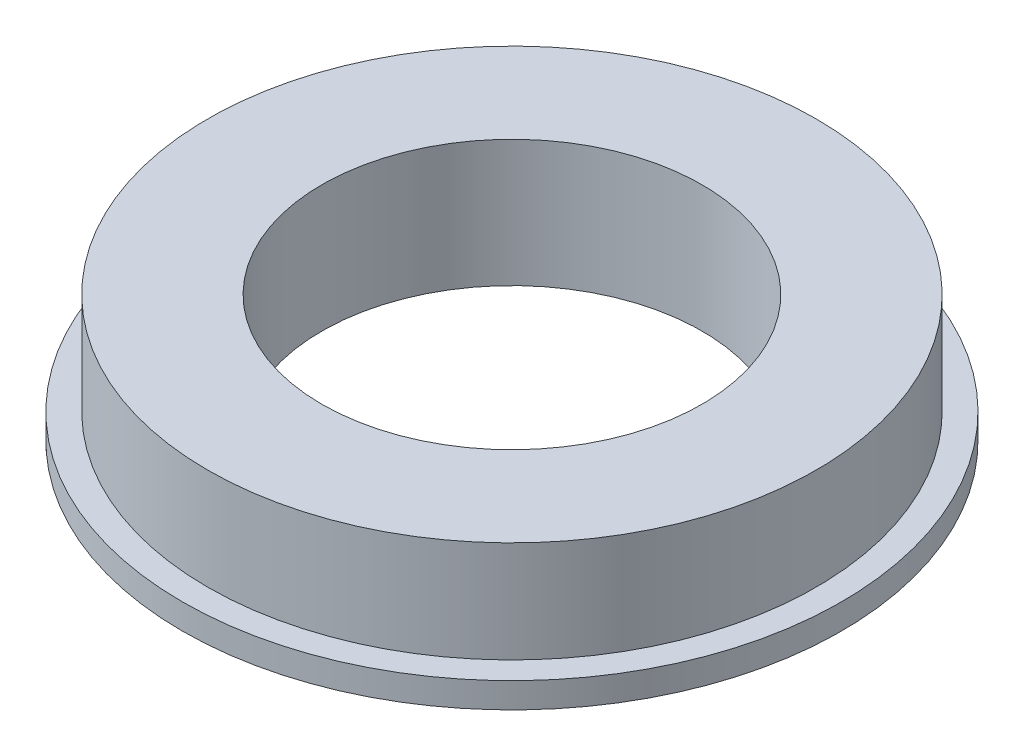
ISO-10303-21;
HEADER;
FILE_DESCRIPTION(('STEP AP214'),'2;1');
FILE_NAME('part.step','',(''),(''),'','','');
FILE_SCHEMA(('AUTOMOTIVE_DESIGN { 1 0 10303 214 1 1 1 1 }'));
ENDSEC;
DATA;
#1=APPLICATION_CONTEXT('core data for automotive mechanical design processes');
#2=APPLICATION_PROTOCOL_DEFINITION('international standard','automotive_design',2000,#1);
#3=PRODUCT_CONTEXT('',#1,'mechanical');
#4=PRODUCT('Part','Part','',(#3));
#5=PRODUCT_RELATED_PRODUCT_CATEGORY('part','',(#4));
#6=PRODUCT_DEFINITION_FORMATION('','',#4);
#7=PRODUCT_DEFINITION_CONTEXT('part definition',#1,'design');
#8=PRODUCT_DEFINITION('design','',#6,#7);
#9=PRODUCT_DEFINITION_SHAPE('','',#8);
#10=(LENGTH_UNIT() NAMED_UNIT(*) SI_UNIT(.MILLI.,.METRE.));
#11=(NAMED_UNIT(*) PLANE_ANGLE_UNIT() SI_UNIT($,.RADIAN.));
#12=(NAMED_UNIT(*) SI_UNIT($,.STERADIAN.) SOLID_ANGLE_UNIT());
#13=UNCERTAINTY_MEASURE_WITH_UNIT(LENGTH_MEASURE(1.E-05),#10,'distance_accuracy_value','');
#14=(GEOMETRIC_REPRESENTATION_CONTEXT(3) GLOBAL_UNCERTAINTY_ASSIGNED_CONTEXT((#13)) GLOBAL_UNIT_ASSIGNED_CONTEXT((#10,
#11,#12)) REPRESENTATION_CONTEXT('',''));
#15=CARTESIAN_POINT('',(0.,0.,0.));
#16=DIRECTION('',(0.,0.,1.));
#17=DIRECTION('',(1.,0.,0.));
#18=AXIS2_PLACEMENT_3D('',#15,#16,#17);
#19=CARTESIAN_POINT('',(0.,5.,0.));
#20=DIRECTION('',(0.,-1.,0.));
#21=DIRECTION('',(0.,0.,-1.));
#22=AXIS2_PLACEMENT_3D('',#19,#20,#21);
#23=CYLINDRICAL_SURFACE('',#22,7.5);
#24=CARTESIAN_POINT('',(0.,5.,0.));
#25=DIRECTION('',(0.,1.,0.));
#26=DIRECTION('',(0.,0.,1.));
#27=AXIS2_PLACEMENT_3D('',#24,#25,#26);
#28=CIRCLE('',#27,7.5);
#29=CARTESIAN_POINT('',(0.,5.,7.5));
#30=VERTEX_POINT('',#29);
#31=EDGE_CURVE('E42',#30,#30,#28,.T.);
#32=ORIENTED_EDGE('',*,*,#31,.T.);
#33=EDGE_LOOP('',(#32));
#34=FACE_BOUND('',#33,.T.);
#35=CARTESIAN_POINT('',(0.,0.,0.));
#36=DIRECTION('',(0.,1.,0.));
#37=DIRECTION('',(0.,0.,1.));
#38=AXIS2_PLACEMENT_3D('',#35,#36,#37);
#39=CIRCLE('',#38,7.5);
#40=CARTESIAN_POINT('',(0.,0.,7.5));
#41=VERTEX_POINT('',#40);
#42=EDGE_CURVE('E38',#41,#41,#39,.T.);
#43=ORIENTED_EDGE('',*,*,#42,.F.);
#44=EDGE_LOOP('',(#43));
#45=FACE_BOUND('',#44,.T.);
#46=ADVANCED_FACE('F35',(#34,#45),#23,.F.);
#47=CARTESIAN_POINT('',(0.,5.,0.));
#48=DIRECTION('',(0.,-1.,0.));
#49=DIRECTION('',(0.,0.,-1.));
#50=AXIS2_PLACEMENT_3D('',#47,#48,#49);
#51=CYLINDRICAL_SURFACE('',#50,12.);
#52=CARTESIAN_POINT('',(0.,1.,0.));
#53=DIRECTION('',(0.,1.,0.));
#54=DIRECTION('',(0.,0.,1.));
#55=AXIS2_PLACEMENT_3D('',#52,#53,#54);
#56=CIRCLE('',#55,12.);
#57=CARTESIAN_POINT('',(0.,1.,12.));
#58=VERTEX_POINT('',#57);
#59=EDGE_CURVE('E51',#58,#58,#56,.T.);
#60=ORIENTED_EDGE('',*,*,#59,.T.);
#61=EDGE_LOOP('',(#60));
#62=FACE_BOUND('',#61,.T.);
#63=CARTESIAN_POINT('',(0.,5.,0.));
#64=DIRECTION('',(0.,1.,0.));
#65=DIRECTION('',(0.,0.,1.));
#66=AXIS2_PLACEMENT_3D('',#63,#64,#65);
#67=CIRCLE('',#66,12.);
#68=CARTESIAN_POINT('',(0.,5.,12.));
#69=VERTEX_POINT('',#68);
#70=EDGE_CURVE('E10',#69,#69,#67,.T.);
#71=ORIENTED_EDGE('',*,*,#70,.F.);
#72=EDGE_LOOP('',(#71));
#73=FACE_BOUND('',#72,.T.);
#74=ADVANCED_FACE('F58',(#62,#73),#51,.T.);
#75=CARTESIAN_POINT('',(0.,5.,0.));
#76=DIRECTION('',(0.,1.,0.));
#77=DIRECTION('',(0.,0.,1.));
#78=AXIS2_PLACEMENT_3D('',#75,#76,#77);
#79=PLANE('',#78);
#80=ORIENTED_EDGE('',*,*,#31,.F.);
#81=EDGE_LOOP('',(#80));
#82=FACE_BOUND('',#81,.T.);
#83=ORIENTED_EDGE('',*,*,#70,.T.);
#84=EDGE_LOOP('',(#83));
#85=FACE_BOUND('',#84,.T.);
#86=ADVANCED_FACE('F75',(#82,#85),#79,.T.);
#87=CARTESIAN_POINT('',(0.,0.,0.));
#88=DIRECTION('',(0.,1.,0.));
#89=DIRECTION('',(0.,0.,1.));
#90=AXIS2_PLACEMENT_3D('',#87,#88,#89);
#91=PLANE('',#90);
#92=ORIENTED_EDGE('',*,*,#42,.T.);
#93=EDGE_LOOP('',(#92));
#94=FACE_BOUND('',#93,.T.);
#95=CARTESIAN_POINT('',(0.,0.,0.));
#96=DIRECTION('',(0.,1.,0.));
#97=DIRECTION('',(0.,0.,1.));
#98=AXIS2_PLACEMENT_3D('',#95,#96,#97);
#99=CIRCLE('',#98,13.);
#100=CARTESIAN_POINT('',(0.,0.,13.));
#101=VERTEX_POINT('',#100);
#102=EDGE_CURVE('E48',#101,#101,#99,.T.);
#103=ORIENTED_EDGE('',*,*,#102,.F.);
#104=EDGE_LOOP('',(#103));
#105=FACE_BOUND('',#104,.T.);
#106=ADVANCED_FACE('F70',(#94,#105),#91,.F.);
#107=CARTESIAN_POINT('',(0.,1.,0.));
#108=DIRECTION('',(0.,-1.,0.));
#109=DIRECTION('',(0.,0.,-1.));
#110=AXIS2_PLACEMENT_3D('',#107,#108,#109);
#111=CYLINDRICAL_SURFACE('',#110,13.);
#112=CARTESIAN_POINT('',(0.,1.,0.));
#113=DIRECTION('',(0.,1.,0.));
#114=DIRECTION('',(0.,0.,1.));
#115=AXIS2_PLACEMENT_3D('',#112,#113,#114);
#116=CIRCLE('',#115,13.);
#117=CARTESIAN_POINT('',(0.,1.,13.));
#118=VERTEX_POINT('',#117);
#119=EDGE_CURVE('E52',#118,#118,#116,.T.);
#120=ORIENTED_EDGE('',*,*,#119,.F.);
#121=EDGE_LOOP('',(#120));
#122=FACE_BOUND('',#121,.T.);
#123=ORIENTED_EDGE('',*,*,#102,.T.);
#124=EDGE_LOOP('',(#123));
#125=FACE_BOUND('',#124,.T.);
#126=ADVANCED_FACE('F64',(#122,#125),#111,.T.);
#127=CARTESIAN_POINT('',(0.,1.,0.));
#128=DIRECTION('',(0.,1.,0.));
#129=DIRECTION('',(0.,0.,1.));
#130=AXIS2_PLACEMENT_3D('',#127,#128,#129);
#131=PLANE('',#130);
#132=ORIENTED_EDGE('',*,*,#59,.F.);
#133=EDGE_LOOP('',(#132));
#134=FACE_BOUND('',#133,.T.);
#135=ORIENTED_EDGE('',*,*,#119,.T.);
#136=EDGE_LOOP('',(#135));
#137=FACE_BOUND('',#136,.T.);
#138=ADVANCED_FACE('F61',(#134,#137),#131,.T.);
#139=CLOSED_SHELL('',(#46,#74,#86,#106,#126,#138));
#140=MANIFOLD_SOLID_BREP('B2',#139);
#141=ADVANCED_BREP_SHAPE_REPRESENTATION('',(#18,#140),#14);
#142=SHAPE_DEFINITION_REPRESENTATION(#9,#141);
ENDSEC;
END-ISO-10303-21;
